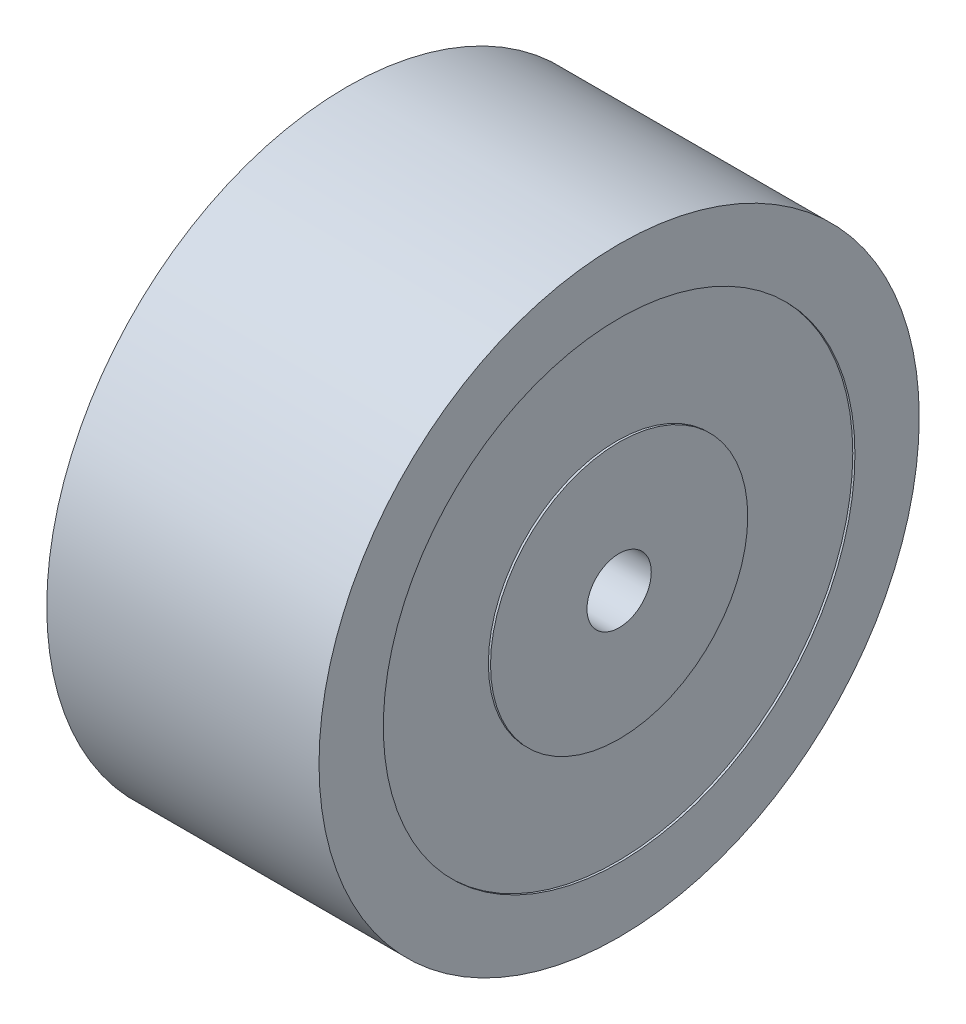
ISO-10303-21;
HEADER;
FILE_DESCRIPTION(('STEP AP214'),'2;1');
FILE_NAME('part.step','',(''),(''),'','','');
FILE_SCHEMA(('AUTOMOTIVE_DESIGN { 1 0 10303 214 1 1 1 1 }'));
ENDSEC;
DATA;
#1=APPLICATION_CONTEXT('core data for automotive mechanical design processes');
#2=APPLICATION_PROTOCOL_DEFINITION('international standard','automotive_design',2000,#1);
#3=PRODUCT_CONTEXT('',#1,'mechanical');
#4=PRODUCT('Part','Part','',(#3));
#5=PRODUCT_RELATED_PRODUCT_CATEGORY('part','',(#4));
#6=PRODUCT_DEFINITION_FORMATION('','',#4);
#7=PRODUCT_DEFINITION_CONTEXT('part definition',#1,'design');
#8=PRODUCT_DEFINITION('design','',#6,#7);
#9=PRODUCT_DEFINITION_SHAPE('','',#8);
#10=(LENGTH_UNIT() NAMED_UNIT(*) SI_UNIT(.MILLI.,.METRE.));
#11=(NAMED_UNIT(*) PLANE_ANGLE_UNIT() SI_UNIT($,.RADIAN.));
#12=(NAMED_UNIT(*) SI_UNIT($,.STERADIAN.) SOLID_ANGLE_UNIT());
#13=UNCERTAINTY_MEASURE_WITH_UNIT(LENGTH_MEASURE(1.E-05),#10,'distance_accuracy_value','');
#14=(GEOMETRIC_REPRESENTATION_CONTEXT(3) GLOBAL_UNCERTAINTY_ASSIGNED_CONTEXT((#13)) GLOBAL_UNIT_ASSIGNED_CONTEXT((#10,
#11,#12)) REPRESENTATION_CONTEXT('',''));
#15=CARTESIAN_POINT('',(0.,0.,0.));
#16=DIRECTION('',(0.,0.,1.));
#17=DIRECTION('',(1.,0.,0.));
#18=AXIS2_PLACEMENT_3D('',#15,#16,#17);
#19=CARTESIAN_POINT('',(20.1697026952491,0.,0.));
#20=DIRECTION('',(1.,0.,0.));
#21=DIRECTION('',(0.,0.,-1.));
#22=AXIS2_PLACEMENT_3D('',#19,#20,#21);
#23=CYLINDRICAL_SURFACE('',#22,11.);
#24=CARTESIAN_POINT('',(0.,0.,0.));
#25=DIRECTION('',(1.,0.,0.));
#26=DIRECTION('',(0.,0.,-1.));
#27=AXIS2_PLACEMENT_3D('',#24,#25,#26);
#28=CIRCLE('',#27,11.);
#29=CARTESIAN_POINT('',(0.,0.,-11.));
#30=VERTEX_POINT('',#29);
#31=EDGE_CURVE('E10',#30,#30,#28,.T.);
#32=ORIENTED_EDGE('',*,*,#31,.T.);
#33=EDGE_LOOP('',(#32));
#34=FACE_BOUND('',#33,.T.);
#35=CARTESIAN_POINT('',(-0.0999999999999925,0.,0.));
#36=DIRECTION('',(1.,0.,0.));
#37=DIRECTION('',(0.,0.,-1.));
#38=AXIS2_PLACEMENT_3D('',#35,#36,#37);
#39=CIRCLE('',#38,11.);
#40=CARTESIAN_POINT('',(-0.0999999999999925,0.,-11.));
#41=VERTEX_POINT('',#40);
#42=EDGE_CURVE('E71',#41,#41,#39,.T.);
#43=ORIENTED_EDGE('',*,*,#42,.F.);
#44=EDGE_LOOP('',(#43));
#45=FACE_BOUND('',#44,.T.);
#46=ADVANCED_FACE('F31',(#34,#45),#23,.F.);
#47=CARTESIAN_POINT('',(0.,14.,0.));
#48=DIRECTION('',(1.,0.,0.));
#49=DIRECTION('',(0.,0.,-1.));
#50=AXIS2_PLACEMENT_3D('',#47,#48,#49);
#51=PLANE('',#50);
#52=CARTESIAN_POINT('',(0.,0.,0.));
#53=DIRECTION('',(1.,0.,0.));
#54=DIRECTION('',(0.,0.,-1.));
#55=AXIS2_PLACEMENT_3D('',#52,#53,#54);
#56=CIRCLE('',#55,14.);
#57=CARTESIAN_POINT('',(0.,0.,-14.));
#58=VERTEX_POINT('',#57);
#59=EDGE_CURVE('E37',#58,#58,#56,.T.);
#60=ORIENTED_EDGE('',*,*,#59,.T.);
#61=EDGE_LOOP('',(#60));
#62=FACE_BOUND('',#61,.T.);
#63=ORIENTED_EDGE('',*,*,#31,.F.);
#64=EDGE_LOOP('',(#63));
#65=FACE_BOUND('',#64,.T.);
#66=ADVANCED_FACE('F79',(#62,#65),#51,.T.);
#67=CARTESIAN_POINT('',(20.1697026952491,0.,0.));
#68=DIRECTION('',(1.,0.,0.));
#69=DIRECTION('',(0.,0.,-1.));
#70=AXIS2_PLACEMENT_3D('',#67,#68,#69);
#71=CYLINDRICAL_SURFACE('',#70,14.);
#72=CARTESIAN_POINT('',(-12.7,0.,0.));
#73=DIRECTION('',(1.,0.,0.));
#74=DIRECTION('',(0.,0.,-1.));
#75=AXIS2_PLACEMENT_3D('',#72,#73,#74);
#76=CIRCLE('',#75,14.);
#77=CARTESIAN_POINT('',(-12.7,0.,-14.));
#78=VERTEX_POINT('',#77);
#79=EDGE_CURVE('E41',#78,#78,#76,.T.);
#80=ORIENTED_EDGE('',*,*,#79,.T.);
#81=EDGE_LOOP('',(#80));
#82=FACE_BOUND('',#81,.T.);
#83=ORIENTED_EDGE('',*,*,#59,.F.);
#84=EDGE_LOOP('',(#83));
#85=FACE_BOUND('',#84,.T.);
#86=ADVANCED_FACE('F83',(#82,#85),#71,.T.);
#87=CARTESIAN_POINT('',(-12.7,11.,0.));
#88=DIRECTION('',(-1.,0.,0.));
#89=DIRECTION('',(0.,0.,1.));
#90=AXIS2_PLACEMENT_3D('',#87,#88,#89);
#91=PLANE('',#90);
#92=CARTESIAN_POINT('',(-12.7,0.,0.));
#93=DIRECTION('',(1.,0.,0.));
#94=DIRECTION('',(0.,0.,-1.));
#95=AXIS2_PLACEMENT_3D('',#92,#93,#94);
#96=CIRCLE('',#95,11.);
#97=CARTESIAN_POINT('',(-12.7,0.,-11.));
#98=VERTEX_POINT('',#97);
#99=EDGE_CURVE('E45',#98,#98,#96,.T.);
#100=ORIENTED_EDGE('',*,*,#99,.T.);
#101=EDGE_LOOP('',(#100));
#102=FACE_BOUND('',#101,.T.);
#103=ORIENTED_EDGE('',*,*,#79,.F.);
#104=EDGE_LOOP('',(#103));
#105=FACE_BOUND('',#104,.T.);
#106=ADVANCED_FACE('F87',(#102,#105),#91,.T.);
#107=CARTESIAN_POINT('',(20.1697026952491,0.,0.));
#108=DIRECTION('',(1.,0.,0.));
#109=DIRECTION('',(0.,0.,-1.));
#110=AXIS2_PLACEMENT_3D('',#107,#108,#109);
#111=CYLINDRICAL_SURFACE('',#110,11.);
#112=CARTESIAN_POINT('',(-12.6,0.,0.));
#113=DIRECTION('',(1.,0.,0.));
#114=DIRECTION('',(0.,0.,-1.));
#115=AXIS2_PLACEMENT_3D('',#112,#113,#114);
#116=CIRCLE('',#115,11.);
#117=CARTESIAN_POINT('',(-12.6,0.,-11.));
#118=VERTEX_POINT('',#117);
#119=EDGE_CURVE('E50',#118,#118,#116,.T.);
#120=ORIENTED_EDGE('',*,*,#119,.T.);
#121=EDGE_LOOP('',(#120));
#122=FACE_BOUND('',#121,.T.);
#123=ORIENTED_EDGE('',*,*,#99,.F.);
#124=EDGE_LOOP('',(#123));
#125=FACE_BOUND('',#124,.T.);
#126=ADVANCED_FACE('F94',(#122,#125),#111,.F.);
#127=CARTESIAN_POINT('',(-12.6,9.,0.));
#128=DIRECTION('',(-1.,0.,0.));
#129=DIRECTION('',(0.,0.,1.));
#130=AXIS2_PLACEMENT_3D('',#127,#128,#129);
#131=PLANE('',#130);
#132=CARTESIAN_POINT('',(-12.6,0.,0.));
#133=DIRECTION('',(1.,0.,0.));
#134=DIRECTION('',(0.,0.,-1.));
#135=AXIS2_PLACEMENT_3D('',#132,#133,#134);
#136=CIRCLE('',#135,9.);
#137=CARTESIAN_POINT('',(-12.6,0.,-9.));
#138=VERTEX_POINT('',#137);
#139=EDGE_CURVE('E53',#138,#138,#136,.T.);
#140=ORIENTED_EDGE('',*,*,#139,.T.);
#141=EDGE_LOOP('',(#140));
#142=FACE_BOUND('',#141,.T.);
#143=ORIENTED_EDGE('',*,*,#119,.F.);
#144=EDGE_LOOP('',(#143));
#145=FACE_BOUND('',#144,.T.);
#146=ADVANCED_FACE('F98',(#142,#145),#131,.T.);
#147=CARTESIAN_POINT('',(20.1697026952491,0.,0.));
#148=DIRECTION('',(1.,0.,0.));
#149=DIRECTION('',(0.,0.,-1.));
#150=AXIS2_PLACEMENT_3D('',#147,#148,#149);
#151=CYLINDRICAL_SURFACE('',#150,9.);
#152=CARTESIAN_POINT('',(-4.6,0.,0.));
#153=DIRECTION('',(1.,0.,0.));
#154=DIRECTION('',(0.,0.,-1.));
#155=AXIS2_PLACEMENT_3D('',#152,#153,#154);
#156=CIRCLE('',#155,9.);
#157=CARTESIAN_POINT('',(-4.6,0.,-9.));
#158=VERTEX_POINT('',#157);
#159=EDGE_CURVE('E56',#158,#158,#156,.T.);
#160=ORIENTED_EDGE('',*,*,#159,.T.);
#161=EDGE_LOOP('',(#160));
#162=FACE_BOUND('',#161,.T.);
#163=ORIENTED_EDGE('',*,*,#139,.F.);
#164=EDGE_LOOP('',(#163));
#165=FACE_BOUND('',#164,.T.);
#166=ADVANCED_FACE('F102',(#162,#165),#151,.F.);
#167=CARTESIAN_POINT('',(-4.6,1.5,0.));
#168=DIRECTION('',(-1.,0.,0.));
#169=DIRECTION('',(0.,0.,1.));
#170=AXIS2_PLACEMENT_3D('',#167,#168,#169);
#171=PLANE('',#170);
#172=CARTESIAN_POINT('',(-4.6,0.,0.));
#173=DIRECTION('',(1.,0.,0.));
#174=DIRECTION('',(0.,0.,-1.));
#175=AXIS2_PLACEMENT_3D('',#172,#173,#174);
#176=CIRCLE('',#175,1.5);
#177=CARTESIAN_POINT('',(-4.6,0.,-1.5));
#178=VERTEX_POINT('',#177);
#179=EDGE_CURVE('E59',#178,#178,#176,.T.);
#180=ORIENTED_EDGE('',*,*,#179,.T.);
#181=EDGE_LOOP('',(#180));
#182=FACE_BOUND('',#181,.T.);
#183=ORIENTED_EDGE('',*,*,#159,.F.);
#184=EDGE_LOOP('',(#183));
#185=FACE_BOUND('',#184,.T.);
#186=ADVANCED_FACE('F106',(#182,#185),#171,.T.);
#187=CARTESIAN_POINT('',(20.1697026952491,0.,0.));
#188=DIRECTION('',(1.,0.,0.));
#189=DIRECTION('',(0.,0.,-1.));
#190=AXIS2_PLACEMENT_3D('',#187,#188,#189);
#191=CYLINDRICAL_SURFACE('',#190,1.5);
#192=CARTESIAN_POINT('',(0.,0.,0.));
#193=DIRECTION('',(1.,0.,0.));
#194=DIRECTION('',(0.,0.,-1.));
#195=AXIS2_PLACEMENT_3D('',#192,#193,#194);
#196=CIRCLE('',#195,1.5);
#197=CARTESIAN_POINT('',(0.,0.,-1.5));
#198=VERTEX_POINT('',#197);
#199=EDGE_CURVE('E62',#198,#198,#196,.T.);
#200=ORIENTED_EDGE('',*,*,#199,.T.);
#201=EDGE_LOOP('',(#200));
#202=FACE_BOUND('',#201,.T.);
#203=ORIENTED_EDGE('',*,*,#179,.F.);
#204=EDGE_LOOP('',(#203));
#205=FACE_BOUND('',#204,.T.);
#206=ADVANCED_FACE('F110',(#202,#205),#191,.F.);
#207=CARTESIAN_POINT('',(0.,6.,0.));
#208=DIRECTION('',(1.,0.,0.));
#209=DIRECTION('',(0.,0.,-1.));
#210=AXIS2_PLACEMENT_3D('',#207,#208,#209);
#211=PLANE('',#210);
#212=CARTESIAN_POINT('',(0.,0.,0.));
#213=DIRECTION('',(1.,0.,0.));
#214=DIRECTION('',(0.,0.,-1.));
#215=AXIS2_PLACEMENT_3D('',#212,#213,#214);
#216=CIRCLE('',#215,6.);
#217=CARTESIAN_POINT('',(0.,0.,-6.));
#218=VERTEX_POINT('',#217);
#219=EDGE_CURVE('E65',#218,#218,#216,.T.);
#220=ORIENTED_EDGE('',*,*,#219,.T.);
#221=EDGE_LOOP('',(#220));
#222=FACE_BOUND('',#221,.T.);
#223=ORIENTED_EDGE('',*,*,#199,.F.);
#224=EDGE_LOOP('',(#223));
#225=FACE_BOUND('',#224,.T.);
#226=ADVANCED_FACE('F114',(#222,#225),#211,.T.);
#227=CARTESIAN_POINT('',(20.1697026952491,0.,0.));
#228=DIRECTION('',(1.,0.,0.));
#229=DIRECTION('',(0.,0.,-1.));
#230=AXIS2_PLACEMENT_3D('',#227,#228,#229);
#231=CYLINDRICAL_SURFACE('',#230,6.);
#232=CARTESIAN_POINT('',(-0.0999999999999925,0.,0.));
#233=DIRECTION('',(1.,0.,0.));
#234=DIRECTION('',(0.,0.,-1.));
#235=AXIS2_PLACEMENT_3D('',#232,#233,#234);
#236=CIRCLE('',#235,6.);
#237=CARTESIAN_POINT('',(-0.0999999999999925,0.,-6.));
#238=VERTEX_POINT('',#237);
#239=EDGE_CURVE('E68',#238,#238,#236,.T.);
#240=ORIENTED_EDGE('',*,*,#239,.T.);
#241=EDGE_LOOP('',(#240));
#242=FACE_BOUND('',#241,.T.);
#243=ORIENTED_EDGE('',*,*,#219,.F.);
#244=EDGE_LOOP('',(#243));
#245=FACE_BOUND('',#244,.T.);
#246=ADVANCED_FACE('F118',(#242,#245),#231,.T.);
#247=CARTESIAN_POINT('',(-0.099999999999993,11.,0.));
#248=DIRECTION('',(1.,0.,0.));
#249=DIRECTION('',(0.,0.,-1.));
#250=AXIS2_PLACEMENT_3D('',#247,#248,#249);
#251=PLANE('',#250);
#252=ORIENTED_EDGE('',*,*,#42,.T.);
#253=EDGE_LOOP('',(#252));
#254=FACE_BOUND('',#253,.T.);
#255=ORIENTED_EDGE('',*,*,#239,.F.);
#256=EDGE_LOOP('',(#255));
#257=FACE_BOUND('',#256,.T.);
#258=ADVANCED_FACE('F75',(#254,#257),#251,.T.);
#259=CLOSED_SHELL('',(#46,#66,#86,#106,#126,#146,#166,#186,#206,#226,#246,#258));
#260=MANIFOLD_SOLID_BREP('B2',#259);
#261=ADVANCED_BREP_SHAPE_REPRESENTATION('',(#18,#260),#14);
#262=SHAPE_DEFINITION_REPRESENTATION(#9,#261);
ENDSEC;
END-ISO-10303-21;
